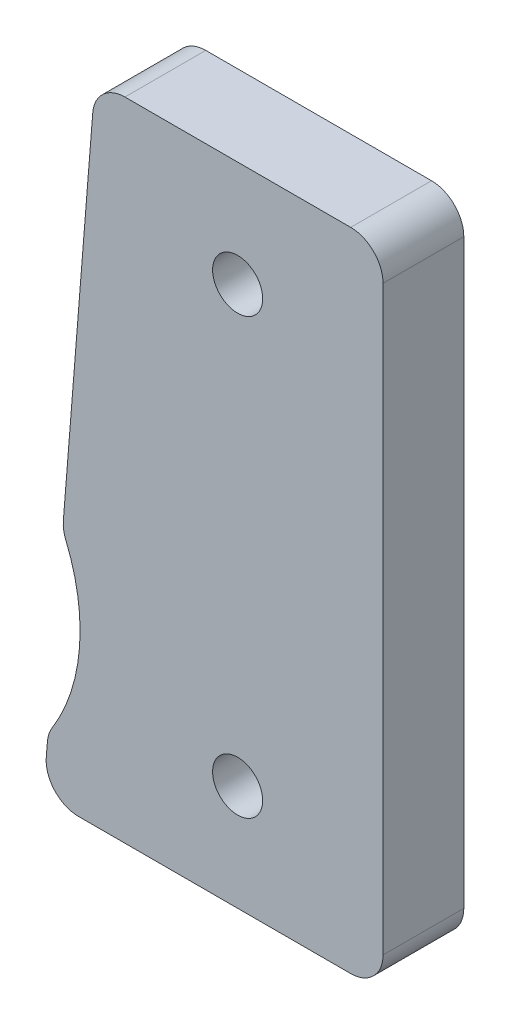
ISO-10303-21;
HEADER;
FILE_DESCRIPTION(('STEP AP214'),'2;1');
FILE_NAME('part.step','',(''),(''),'','','');
FILE_SCHEMA(('AUTOMOTIVE_DESIGN { 1 0 10303 214 1 1 1 1 }'));
ENDSEC;
DATA;
#1=APPLICATION_CONTEXT('core data for automotive mechanical design processes');
#2=APPLICATION_PROTOCOL_DEFINITION('international standard','automotive_design',2000,#1);
#3=PRODUCT_CONTEXT('',#1,'mechanical');
#4=PRODUCT('Part','Part','',(#3));
#5=PRODUCT_RELATED_PRODUCT_CATEGORY('part','',(#4));
#6=PRODUCT_DEFINITION_FORMATION('','',#4);
#7=PRODUCT_DEFINITION_CONTEXT('part definition',#1,'design');
#8=PRODUCT_DEFINITION('design','',#6,#7);
#9=PRODUCT_DEFINITION_SHAPE('','',#8);
#10=(LENGTH_UNIT() NAMED_UNIT(*) SI_UNIT(.MILLI.,.METRE.));
#11=(NAMED_UNIT(*) PLANE_ANGLE_UNIT() SI_UNIT($,.RADIAN.));
#12=(NAMED_UNIT(*) SI_UNIT($,.STERADIAN.) SOLID_ANGLE_UNIT());
#13=UNCERTAINTY_MEASURE_WITH_UNIT(LENGTH_MEASURE(1.E-05),#10,'distance_accuracy_value','');
#14=(GEOMETRIC_REPRESENTATION_CONTEXT(3) GLOBAL_UNCERTAINTY_ASSIGNED_CONTEXT((#13)) GLOBAL_UNIT_ASSIGNED_CONTEXT((#10,
#11,#12)) REPRESENTATION_CONTEXT('',''));
#15=CARTESIAN_POINT('',(0.,0.,0.));
#16=DIRECTION('',(0.,0.,1.));
#17=DIRECTION('',(1.,0.,0.));
#18=AXIS2_PLACEMENT_3D('',#15,#16,#17);
#19=CARTESIAN_POINT('',(-15.,-20.,5.));
#20=DIRECTION('',(0.,1.,0.));
#21=DIRECTION('',(0.,0.,1.));
#22=AXIS2_PLACEMENT_3D('',#19,#20,#21);
#23=PLANE('',#22);
#24=DIRECTION('',(1.,0.,0.));
#25=VECTOR('',#24,1.);
#26=CARTESIAN_POINT('',(-15.,-20.,0.));
#27=LINE('',#26,#25);
#28=CARTESIAN_POINT('',(-9.85124889341769,-20.,0.));
#29=VERTEX_POINT('',#28);
#30=CARTESIAN_POINT('',(7.,-20.,0.));
#31=VERTEX_POINT('',#30);
#32=EDGE_CURVE('E137',#29,#31,#27,.T.);
#33=ORIENTED_EDGE('',*,*,#32,.T.);
#34=DIRECTION('',(0.,0.,-1.));
#35=VECTOR('',#34,1.);
#36=CARTESIAN_POINT('',(7.,-20.,5.));
#37=LINE('',#36,#35);
#38=CARTESIAN_POINT('',(7.,-20.,5.));
#39=VERTEX_POINT('',#38);
#40=EDGE_CURVE('E11',#31,#39,#37,.F.);
#41=ORIENTED_EDGE('',*,*,#40,.T.);
#42=DIRECTION('',(1.,0.,0.));
#43=VECTOR('',#42,1.);
#44=CARTESIAN_POINT('',(-15.,-20.,5.));
#45=LINE('',#44,#43);
#46=CARTESIAN_POINT('',(-9.85124889341769,-20.,5.));
#47=VERTEX_POINT('',#46);
#48=EDGE_CURVE('E208',#47,#39,#45,.T.);
#49=ORIENTED_EDGE('',*,*,#48,.F.);
#50=DIRECTION('',(0.,0.,1.));
#51=VECTOR('',#50,1.);
#52=CARTESIAN_POINT('',(-9.85124889341769,-20.,5.));
#53=LINE('',#52,#51);
#54=EDGE_CURVE('E172',#47,#29,#53,.F.);
#55=ORIENTED_EDGE('',*,*,#54,.T.);
#56=EDGE_LOOP('',(#33,#41,#49,#55));
#57=FACE_BOUND('',#56,.T.);
#58=ADVANCED_FACE('F36',(#57),#23,.F.);
#59=CARTESIAN_POINT('',(-8.81985403305253,20.,-795.));
#60=DIRECTION('',(0.996819915804778,-0.0796872352071232,0.));
#61=DIRECTION('',(0.0796872352071232,0.996819915804778,0.));
#62=AXIS2_PLACEMENT_3D('',#59,#60,#61);
#63=PLANE('',#62);
#64=DIRECTION('',(-0.0796872352071232,-0.996819915804778,0.));
#65=VECTOR('',#64,1.);
#66=CARTESIAN_POINT('',(-10.3525239326356,0.827595834039167,0.));
#67=LINE('',#66,#65);
#68=CARTESIAN_POINT('',(-8.9669963174098,18.1593744704143,0.));
#69=VERTEX_POINT('',#68);
#70=CARTESIAN_POINT('',(-10.7889625102936,-4.63188164819745,0.));
#71=VERTEX_POINT('',#70);
#72=EDGE_CURVE('E146',#69,#71,#67,.T.);
#73=ORIENTED_EDGE('',*,*,#72,.T.);
#74=DIRECTION('',(0.,0.,1.));
#75=VECTOR('',#74,1.);
#76=CARTESIAN_POINT('',(-10.7889625102936,-4.63188164819745,-795.));
#77=LINE('',#76,#75);
#78=CARTESIAN_POINT('',(-10.7889625102936,-4.63188164819745,5.));
#79=VERTEX_POINT('',#78);
#80=EDGE_CURVE('E174',#71,#79,#77,.T.);
#81=ORIENTED_EDGE('',*,*,#80,.T.);
#82=DIRECTION('',(0.0796872352071232,0.996819915804778,0.));
#83=VECTOR('',#82,1.);
#84=CARTESIAN_POINT('',(-8.81985403305253,20.,5.));
#85=LINE('',#84,#83);
#86=CARTESIAN_POINT('',(-8.9669963174098,18.1593744704142,5.));
#87=VERTEX_POINT('',#86);
#88=EDGE_CURVE('E232',#79,#87,#85,.T.);
#89=ORIENTED_EDGE('',*,*,#88,.T.);
#90=DIRECTION('',(0.,0.,1.));
#91=VECTOR('',#90,1.);
#92=CARTESIAN_POINT('',(-8.9669963174098,18.1593744704142,-795.));
#93=LINE('',#92,#91);
#94=EDGE_CURVE('E170',#87,#69,#93,.F.);
#95=ORIENTED_EDGE('',*,*,#94,.T.);
#96=EDGE_LOOP('',(#73,#81,#89,#95));
#97=FACE_BOUND('',#96,.T.);
#98=ADVANCED_FACE('F243',(#97),#63,.F.);
#99=CARTESIAN_POINT('',(-15.,20.,5.));
#100=DIRECTION('',(0.,-1.,0.));
#101=DIRECTION('',(0.,0.,-1.));
#102=AXIS2_PLACEMENT_3D('',#99,#100,#101);
#103=PLANE('',#102);
#104=DIRECTION('',(-1.,0.,0.));
#105=VECTOR('',#104,1.);
#106=CARTESIAN_POINT('',(-15.,20.,5.));
#107=LINE('',#106,#105);
#108=CARTESIAN_POINT('',(7.,20.,5.));
#109=VERTEX_POINT('',#108);
#110=CARTESIAN_POINT('',(-6.97335648580024,20.,5.));
#111=VERTEX_POINT('',#110);
#112=EDGE_CURVE('E205',#109,#111,#107,.T.);
#113=ORIENTED_EDGE('',*,*,#112,.F.);
#114=DIRECTION('',(0.,0.,-1.));
#115=VECTOR('',#114,1.);
#116=CARTESIAN_POINT('',(7.,20.,0.));
#117=LINE('',#116,#115);
#118=CARTESIAN_POINT('',(7.,20.,0.));
#119=VERTEX_POINT('',#118);
#120=EDGE_CURVE('E135',#109,#119,#117,.T.);
#121=ORIENTED_EDGE('',*,*,#120,.T.);
#122=DIRECTION('',(-1.,0.,0.));
#123=VECTOR('',#122,1.);
#124=CARTESIAN_POINT('',(-15.,20.,0.));
#125=LINE('',#124,#123);
#126=CARTESIAN_POINT('',(-6.97335648580024,20.,0.));
#127=VERTEX_POINT('',#126);
#128=EDGE_CURVE('E128',#119,#127,#125,.T.);
#129=ORIENTED_EDGE('',*,*,#128,.T.);
#130=DIRECTION('',(0.,0.,1.));
#131=VECTOR('',#130,1.);
#132=CARTESIAN_POINT('',(-6.97335648580024,20.,5.));
#133=LINE('',#132,#131);
#134=EDGE_CURVE('E133',#127,#111,#133,.T.);
#135=ORIENTED_EDGE('',*,*,#134,.T.);
#136=EDGE_LOOP('',(#113,#121,#129,#135));
#137=FACE_BOUND('',#136,.T.);
#138=ADVANCED_FACE('F131',(#137),#103,.F.);
#139=CARTESIAN_POINT('',(0.,0.,5.));
#140=DIRECTION('',(0.,0.,-1.));
#141=DIRECTION('',(-1.,0.,0.));
#142=AXIS2_PLACEMENT_3D('',#139,#140,#141);
#143=PLANE('',#142);
#144=CARTESIAN_POINT('',(0.,13.45,5.));
#145=DIRECTION('',(0.,0.,1.));
#146=DIRECTION('',(1.,0.,0.));
#147=AXIS2_PLACEMENT_3D('',#144,#145,#146);
#148=CIRCLE('',#147,1.54999999999999);
#149=CARTESIAN_POINT('',(1.54999999999998,13.45,5.));
#150=VERTEX_POINT('',#149);
#151=EDGE_CURVE('E225',#150,#150,#148,.T.);
#152=ORIENTED_EDGE('',*,*,#151,.F.);
#153=EDGE_LOOP('',(#152));
#154=FACE_BOUND('',#153,.T.);
#155=CARTESIAN_POINT('',(0.,-13.45,5.));
#156=DIRECTION('',(0.,0.,1.));
#157=DIRECTION('',(1.,0.,0.));
#158=AXIS2_PLACEMENT_3D('',#155,#156,#157);
#159=CIRCLE('',#158,1.54999999999999);
#160=CARTESIAN_POINT('',(1.54999999999998,-13.45,5.));
#161=VERTEX_POINT('',#160);
#162=EDGE_CURVE('E224',#161,#161,#159,.T.);
#163=ORIENTED_EDGE('',*,*,#162,.F.);
#164=EDGE_LOOP('',(#163));
#165=FACE_BOUND('',#164,.T.);
#166=DIRECTION('',(0.,1.,0.));
#167=VECTOR('',#166,1.);
#168=CARTESIAN_POINT('',(9.,20.,5.));
#169=LINE('',#168,#167);
#170=CARTESIAN_POINT('',(9.,-18.,5.));
#171=VERTEX_POINT('',#170);
#172=CARTESIAN_POINT('',(9.,18.,5.));
#173=VERTEX_POINT('',#172);
#174=EDGE_CURVE('E206',#171,#173,#169,.T.);
#175=ORIENTED_EDGE('',*,*,#174,.T.);
#176=CARTESIAN_POINT('',(7.,18.,5.));
#177=DIRECTION('',(0.,0.,-1.));
#178=DIRECTION('',(-1.,0.,0.));
#179=AXIS2_PLACEMENT_3D('',#176,#177,#178);
#180=CIRCLE('',#179,2.);
#181=EDGE_CURVE('E44',#173,#109,#180,.F.);
#182=ORIENTED_EDGE('',*,*,#181,.T.);
#183=ORIENTED_EDGE('',*,*,#112,.T.);
#184=CARTESIAN_POINT('',(-6.97335648580024,18.,5.));
#185=DIRECTION('',(0.,0.,-1.));
#186=DIRECTION('',(-1.,0.,0.));
#187=AXIS2_PLACEMENT_3D('',#184,#185,#186);
#188=CIRCLE('',#187,2.);
#189=EDGE_CURVE('E155',#111,#87,#188,.F.);
#190=ORIENTED_EDGE('',*,*,#189,.T.);
#191=ORIENTED_EDGE('',*,*,#88,.F.);
#192=CARTESIAN_POINT('',(-8.79532267868406,-4.79125611861169,5.));
#193=DIRECTION('',(0.,0.,-1.));
#194=DIRECTION('',(-1.,0.,0.));
#195=AXIS2_PLACEMENT_3D('',#192,#193,#194);
#196=CIRCLE('',#195,2.);
#197=CARTESIAN_POINT('',(-10.6404600596197,-5.56292187881736,5.));
#198=VERTEX_POINT('',#197);
#199=EDGE_CURVE('E179',#79,#198,#196,.F.);
#200=ORIENTED_EDGE('',*,*,#199,.T.);
#201=CARTESIAN_POINT('',(-21.25,-9.99999999999995,5.));
#202=DIRECTION('',(0.,0.,1.));
#203=DIRECTION('',(1.,0.,0.));
#204=AXIS2_PLACEMENT_3D('',#201,#202,#203);
#205=CIRCLE('',#204,11.5);
#206=CARTESIAN_POINT('',(-11.4801105505937,-16.0662393743059,5.));
#207=VERTEX_POINT('',#206);
#208=EDGE_CURVE('E215',#207,#198,#205,.T.);
#209=ORIENTED_EDGE('',*,*,#208,.F.);
#210=CARTESIAN_POINT('',(-9.7809993420013,-17.1212375263591,5.));
#211=DIRECTION('',(0.,0.,-1.));
#212=DIRECTION('',(-1.,0.,0.));
#213=AXIS2_PLACEMENT_3D('',#210,#211,#212);
#214=CIRCLE('',#213,2.);
#215=CARTESIAN_POINT('',(-11.7746391736109,-16.9618630559449,5.));
#216=VERTEX_POINT('',#215);
#217=EDGE_CURVE('E177',#207,#216,#214,.F.);
#218=ORIENTED_EDGE('',*,*,#217,.T.);
#219=CARTESIAN_POINT('',(-11.8448887250272,-17.8406255295858,5.));
#220=VERTEX_POINT('',#219);
#221=EDGE_CURVE('E138',#220,#216,#85,.T.);
#222=ORIENTED_EDGE('',*,*,#221,.F.);
#223=CARTESIAN_POINT('',(-9.85124889341769,-18.,5.));
#224=DIRECTION('',(0.,0.,-1.));
#225=DIRECTION('',(-1.,0.,0.));
#226=AXIS2_PLACEMENT_3D('',#223,#224,#225);
#227=CIRCLE('',#226,2.);
#228=EDGE_CURVE('E149',#220,#47,#227,.F.);
#229=ORIENTED_EDGE('',*,*,#228,.T.);
#230=ORIENTED_EDGE('',*,*,#48,.T.);
#231=CARTESIAN_POINT('',(7.,-18.,5.));
#232=DIRECTION('',(0.,0.,-1.));
#233=DIRECTION('',(-1.,0.,0.));
#234=AXIS2_PLACEMENT_3D('',#231,#232,#233);
#235=CIRCLE('',#234,2.);
#236=EDGE_CURVE('E201',#39,#171,#235,.F.);
#237=ORIENTED_EDGE('',*,*,#236,.T.);
#238=EDGE_LOOP('',(#175,#182,#183,#190,#191,#200,#209,#218,#222,#229,#230,#237));
#239=FACE_BOUND('',#238,.T.);
#240=ADVANCED_FACE('F204',(#154,#165,#239),#143,.F.);
#241=CARTESIAN_POINT('',(0.,0.,0.));
#242=DIRECTION('',(0.,0.,-1.));
#243=DIRECTION('',(-1.,0.,0.));
#244=AXIS2_PLACEMENT_3D('',#241,#242,#243);
#245=PLANE('',#244);
#246=ORIENTED_EDGE('',*,*,#128,.F.);
#247=CARTESIAN_POINT('',(7.,18.,0.));
#248=DIRECTION('',(0.,0.,-1.));
#249=DIRECTION('',(-1.,0.,0.));
#250=AXIS2_PLACEMENT_3D('',#247,#248,#249);
#251=CIRCLE('',#250,2.);
#252=CARTESIAN_POINT('',(9.,18.,0.));
#253=VERTEX_POINT('',#252);
#254=EDGE_CURVE('E195',#119,#253,#251,.T.);
#255=ORIENTED_EDGE('',*,*,#254,.T.);
#256=DIRECTION('',(0.,1.,0.));
#257=VECTOR('',#256,1.);
#258=CARTESIAN_POINT('',(9.,20.,0.));
#259=LINE('',#258,#257);
#260=CARTESIAN_POINT('',(9.,-18.,0.));
#261=VERTEX_POINT('',#260);
#262=EDGE_CURVE('E212',#261,#253,#259,.T.);
#263=ORIENTED_EDGE('',*,*,#262,.F.);
#264=CARTESIAN_POINT('',(7.,-18.,0.));
#265=DIRECTION('',(0.,0.,-1.));
#266=DIRECTION('',(-1.,0.,0.));
#267=AXIS2_PLACEMENT_3D('',#264,#265,#266);
#268=CIRCLE('',#267,2.);
#269=EDGE_CURVE('E193',#261,#31,#268,.T.);
#270=ORIENTED_EDGE('',*,*,#269,.T.);
#271=ORIENTED_EDGE('',*,*,#32,.F.);
#272=CARTESIAN_POINT('',(-9.85124889341769,-18.,0.));
#273=DIRECTION('',(0.,0.,-1.));
#274=DIRECTION('',(-1.,0.,0.));
#275=AXIS2_PLACEMENT_3D('',#272,#273,#274);
#276=CIRCLE('',#275,2.);
#277=CARTESIAN_POINT('',(-11.8448887250272,-17.8406255295858,0.));
#278=VERTEX_POINT('',#277);
#279=EDGE_CURVE('E150',#29,#278,#276,.T.);
#280=ORIENTED_EDGE('',*,*,#279,.T.);
#281=CARTESIAN_POINT('',(-11.7746391736109,-16.9618630559449,0.));
#282=VERTEX_POINT('',#281);
#283=EDGE_CURVE('E159',#282,#278,#67,.T.);
#284=ORIENTED_EDGE('',*,*,#283,.F.);
#285=CARTESIAN_POINT('',(-9.7809993420013,-17.1212375263591,0.));
#286=DIRECTION('',(0.,0.,-1.));
#287=DIRECTION('',(-1.,0.,0.));
#288=AXIS2_PLACEMENT_3D('',#285,#286,#287);
#289=CIRCLE('',#288,2.);
#290=CARTESIAN_POINT('',(-11.4801105505937,-16.0662393743059,0.));
#291=VERTEX_POINT('',#290);
#292=EDGE_CURVE('E185',#282,#291,#289,.T.);
#293=ORIENTED_EDGE('',*,*,#292,.T.);
#294=CARTESIAN_POINT('',(-21.25,-9.99999999999995,0.));
#295=DIRECTION('',(0.,0.,-1.));
#296=DIRECTION('',(-1.,0.,0.));
#297=AXIS2_PLACEMENT_3D('',#294,#295,#296);
#298=CIRCLE('',#297,11.5);
#299=CARTESIAN_POINT('',(-10.6404600596197,-5.56292187881736,0.));
#300=VERTEX_POINT('',#299);
#301=EDGE_CURVE('E218',#300,#291,#298,.T.);
#302=ORIENTED_EDGE('',*,*,#301,.F.);
#303=CARTESIAN_POINT('',(-8.79532267868406,-4.79125611861169,0.));
#304=DIRECTION('',(0.,0.,-1.));
#305=DIRECTION('',(-1.,0.,0.));
#306=AXIS2_PLACEMENT_3D('',#303,#304,#305);
#307=CIRCLE('',#306,2.);
#308=EDGE_CURVE('E187',#300,#71,#307,.T.);
#309=ORIENTED_EDGE('',*,*,#308,.T.);
#310=ORIENTED_EDGE('',*,*,#72,.F.);
#311=CARTESIAN_POINT('',(-6.97335648580024,18.,0.));
#312=DIRECTION('',(0.,0.,-1.));
#313=DIRECTION('',(-1.,0.,0.));
#314=AXIS2_PLACEMENT_3D('',#311,#312,#313);
#315=CIRCLE('',#314,2.);
#316=EDGE_CURVE('E142',#69,#127,#315,.T.);
#317=ORIENTED_EDGE('',*,*,#316,.T.);
#318=EDGE_LOOP('',(#246,#255,#263,#270,#271,#280,#284,#293,#302,#309,#310,#317));
#319=FACE_BOUND('',#318,.T.);
#320=CARTESIAN_POINT('',(0.,13.45,0.));
#321=DIRECTION('',(0.,0.,-1.));
#322=DIRECTION('',(-1.,0.,0.));
#323=AXIS2_PLACEMENT_3D('',#320,#321,#322);
#324=CIRCLE('',#323,1.54999999999999);
#325=CARTESIAN_POINT('',(-1.55000000000001,13.45,0.));
#326=VERTEX_POINT('',#325);
#327=EDGE_CURVE('E162',#326,#326,#324,.T.);
#328=ORIENTED_EDGE('',*,*,#327,.F.);
#329=EDGE_LOOP('',(#328));
#330=FACE_BOUND('',#329,.T.);
#331=CARTESIAN_POINT('',(0.,-13.45,0.));
#332=DIRECTION('',(0.,0.,-1.));
#333=DIRECTION('',(-1.,0.,0.));
#334=AXIS2_PLACEMENT_3D('',#331,#332,#333);
#335=CIRCLE('',#334,1.54999999999999);
#336=CARTESIAN_POINT('',(-1.55000000000001,-13.45,0.));
#337=VERTEX_POINT('',#336);
#338=EDGE_CURVE('E228',#337,#337,#335,.T.);
#339=ORIENTED_EDGE('',*,*,#338,.F.);
#340=EDGE_LOOP('',(#339));
#341=FACE_BOUND('',#340,.T.);
#342=ADVANCED_FACE('F143',(#319,#330,#341),#245,.T.);
#343=ORIENTED_EDGE('',*,*,#221,.T.);
#344=DIRECTION('',(0.,0.,1.));
#345=VECTOR('',#344,1.);
#346=CARTESIAN_POINT('',(-11.7746391736109,-16.9618630559449,-795.));
#347=LINE('',#346,#345);
#348=EDGE_CURVE('E189',#216,#282,#347,.F.);
#349=ORIENTED_EDGE('',*,*,#348,.T.);
#350=ORIENTED_EDGE('',*,*,#283,.T.);
#351=DIRECTION('',(0.,0.,1.));
#352=VECTOR('',#351,1.);
#353=CARTESIAN_POINT('',(-11.8448887250272,-17.8406255295858,-795.));
#354=LINE('',#353,#352);
#355=EDGE_CURVE('E167',#278,#220,#354,.T.);
#356=ORIENTED_EDGE('',*,*,#355,.T.);
#357=EDGE_LOOP('',(#343,#349,#350,#356));
#358=FACE_BOUND('',#357,.T.);
#359=ADVANCED_FACE('F261',(#358),#63,.F.);
#360=CARTESIAN_POINT('',(0.,-13.45,-5.));
#361=DIRECTION('',(0.,0.,1.));
#362=DIRECTION('',(1.,0.,0.));
#363=AXIS2_PLACEMENT_3D('',#360,#361,#362);
#364=CYLINDRICAL_SURFACE('',#363,1.54999999999999);
#365=ORIENTED_EDGE('',*,*,#338,.T.);
#366=EDGE_LOOP('',(#365));
#367=FACE_BOUND('',#366,.T.);
#368=ORIENTED_EDGE('',*,*,#162,.T.);
#369=EDGE_LOOP('',(#368));
#370=FACE_BOUND('',#369,.T.);
#371=ADVANCED_FACE('F304',(#367,#370),#364,.F.);
#372=CARTESIAN_POINT('',(0.,13.45,-5.));
#373=DIRECTION('',(0.,0.,1.));
#374=DIRECTION('',(1.,0.,0.));
#375=AXIS2_PLACEMENT_3D('',#372,#373,#374);
#376=CYLINDRICAL_SURFACE('',#375,1.54999999999999);
#377=ORIENTED_EDGE('',*,*,#327,.T.);
#378=EDGE_LOOP('',(#377));
#379=FACE_BOUND('',#378,.T.);
#380=ORIENTED_EDGE('',*,*,#151,.T.);
#381=EDGE_LOOP('',(#380));
#382=FACE_BOUND('',#381,.T.);
#383=ADVANCED_FACE('F287',(#379,#382),#376,.F.);
#384=CARTESIAN_POINT('',(-6.97335648580024,18.,5.));
#385=DIRECTION('',(0.,0.,1.));
#386=DIRECTION('',(1.,0.,0.));
#387=AXIS2_PLACEMENT_3D('',#384,#385,#386);
#388=CYLINDRICAL_SURFACE('',#387,2.);
#389=ORIENTED_EDGE('',*,*,#316,.F.);
#390=ORIENTED_EDGE('',*,*,#94,.F.);
#391=ORIENTED_EDGE('',*,*,#189,.F.);
#392=ORIENTED_EDGE('',*,*,#134,.F.);
#393=EDGE_LOOP('',(#389,#390,#391,#392));
#394=FACE_BOUND('',#393,.T.);
#395=ADVANCED_FACE('F153',(#394),#388,.T.);
#396=CARTESIAN_POINT('',(-9.85124889341769,-18.,-795.));
#397=DIRECTION('',(0.,0.,1.));
#398=DIRECTION('',(1.,0.,0.));
#399=AXIS2_PLACEMENT_3D('',#396,#397,#398);
#400=CYLINDRICAL_SURFACE('',#399,2.);
#401=ORIENTED_EDGE('',*,*,#279,.F.);
#402=ORIENTED_EDGE('',*,*,#54,.F.);
#403=ORIENTED_EDGE('',*,*,#228,.F.);
#404=ORIENTED_EDGE('',*,*,#355,.F.);
#405=EDGE_LOOP('',(#401,#402,#403,#404));
#406=FACE_BOUND('',#405,.T.);
#407=ADVANCED_FACE('F265',(#406),#400,.T.);
#408=CARTESIAN_POINT('',(-21.25,-9.99999999999995,-5.));
#409=DIRECTION('',(0.,0.,1.));
#410=DIRECTION('',(1.,0.,0.));
#411=AXIS2_PLACEMENT_3D('',#408,#409,#410);
#412=CYLINDRICAL_SURFACE('',#411,11.5);
#413=ORIENTED_EDGE('',*,*,#208,.T.);
#414=DIRECTION('',(0.,0.,1.));
#415=VECTOR('',#414,1.);
#416=CARTESIAN_POINT('',(-10.6404600596197,-5.56292187881736,-5.));
#417=LINE('',#416,#415);
#418=EDGE_CURVE('E183',#198,#300,#417,.F.);
#419=ORIENTED_EDGE('',*,*,#418,.T.);
#420=ORIENTED_EDGE('',*,*,#301,.T.);
#421=DIRECTION('',(0.,0.,1.));
#422=VECTOR('',#421,1.);
#423=CARTESIAN_POINT('',(-11.4801105505937,-16.0662393743059,-5.));
#424=LINE('',#423,#422);
#425=EDGE_CURVE('E181',#291,#207,#424,.T.);
#426=ORIENTED_EDGE('',*,*,#425,.T.);
#427=EDGE_LOOP('',(#413,#419,#420,#426));
#428=FACE_BOUND('',#427,.T.);
#429=ADVANCED_FACE('F250',(#428),#412,.F.);
#430=CARTESIAN_POINT('',(-8.79532267868406,-4.79125611861169,-5.));
#431=DIRECTION('',(0.,0.,1.));
#432=DIRECTION('',(1.,0.,0.));
#433=AXIS2_PLACEMENT_3D('',#430,#431,#432);
#434=CYLINDRICAL_SURFACE('',#433,2.);
#435=ORIENTED_EDGE('',*,*,#308,.F.);
#436=ORIENTED_EDGE('',*,*,#418,.F.);
#437=ORIENTED_EDGE('',*,*,#199,.F.);
#438=ORIENTED_EDGE('',*,*,#80,.F.);
#439=EDGE_LOOP('',(#435,#436,#437,#438));
#440=FACE_BOUND('',#439,.T.);
#441=ADVANCED_FACE('F254',(#440),#434,.T.);
#442=CARTESIAN_POINT('',(-9.7809993420013,-17.1212375263591,-5.));
#443=DIRECTION('',(0.,0.,1.));
#444=DIRECTION('',(1.,0.,0.));
#445=AXIS2_PLACEMENT_3D('',#442,#443,#444);
#446=CYLINDRICAL_SURFACE('',#445,2.);
#447=ORIENTED_EDGE('',*,*,#217,.F.);
#448=ORIENTED_EDGE('',*,*,#425,.F.);
#449=ORIENTED_EDGE('',*,*,#292,.F.);
#450=ORIENTED_EDGE('',*,*,#348,.F.);
#451=EDGE_LOOP('',(#447,#448,#449,#450));
#452=FACE_BOUND('',#451,.T.);
#453=ADVANCED_FACE('F257',(#452),#446,.T.);
#454=CARTESIAN_POINT('',(9.,20.,71.7942705683239));
#455=DIRECTION('',(1.,0.,0.));
#456=DIRECTION('',(0.,1.,0.));
#457=AXIS2_PLACEMENT_3D('',#454,#455,#456);
#458=PLANE('',#457);
#459=ORIENTED_EDGE('',*,*,#262,.T.);
#460=DIRECTION('',(0.,0.,-1.));
#461=VECTOR('',#460,1.);
#462=CARTESIAN_POINT('',(9.,18.,5.));
#463=LINE('',#462,#461);
#464=EDGE_CURVE('E57',#253,#173,#463,.F.);
#465=ORIENTED_EDGE('',*,*,#464,.T.);
#466=ORIENTED_EDGE('',*,*,#174,.F.);
#467=DIRECTION('',(0.,0.,-1.));
#468=VECTOR('',#467,1.);
#469=CARTESIAN_POINT('',(9.,-18.,0.));
#470=LINE('',#469,#468);
#471=EDGE_CURVE('E197',#171,#261,#470,.T.);
#472=ORIENTED_EDGE('',*,*,#471,.T.);
#473=EDGE_LOOP('',(#459,#465,#466,#472));
#474=FACE_BOUND('',#473,.T.);
#475=ADVANCED_FACE('F213',(#474),#458,.T.);
#476=CARTESIAN_POINT('',(7.,18.,5.));
#477=DIRECTION('',(0.,0.,1.));
#478=DIRECTION('',(1.,0.,0.));
#479=AXIS2_PLACEMENT_3D('',#476,#477,#478);
#480=CYLINDRICAL_SURFACE('',#479,2.);
#481=ORIENTED_EDGE('',*,*,#181,.F.);
#482=ORIENTED_EDGE('',*,*,#464,.F.);
#483=ORIENTED_EDGE('',*,*,#254,.F.);
#484=ORIENTED_EDGE('',*,*,#120,.F.);
#485=EDGE_LOOP('',(#481,#482,#483,#484));
#486=FACE_BOUND('',#485,.T.);
#487=ADVANCED_FACE('F210',(#486),#480,.T.);
#488=CARTESIAN_POINT('',(7.,-18.,71.7942705683239));
#489=DIRECTION('',(0.,0.,1.));
#490=DIRECTION('',(1.,0.,0.));
#491=AXIS2_PLACEMENT_3D('',#488,#489,#490);
#492=CYLINDRICAL_SURFACE('',#491,2.);
#493=ORIENTED_EDGE('',*,*,#236,.F.);
#494=ORIENTED_EDGE('',*,*,#40,.F.);
#495=ORIENTED_EDGE('',*,*,#269,.F.);
#496=ORIENTED_EDGE('',*,*,#471,.F.);
#497=EDGE_LOOP('',(#493,#494,#495,#496));
#498=FACE_BOUND('',#497,.T.);
#499=ADVANCED_FACE('F38',(#498),#492,.T.);
#500=CLOSED_SHELL('',(#58,#98,#138,#240,#342,#359,#371,#383,#395,#407,#429,#441,#453,#475,#487,#499));
#501=MANIFOLD_SOLID_BREP('B2',#500);
#502=ADVANCED_BREP_SHAPE_REPRESENTATION('',(#18,#501),#14);
#503=SHAPE_DEFINITION_REPRESENTATION(#9,#502);
ENDSEC;
END-ISO-10303-21;
